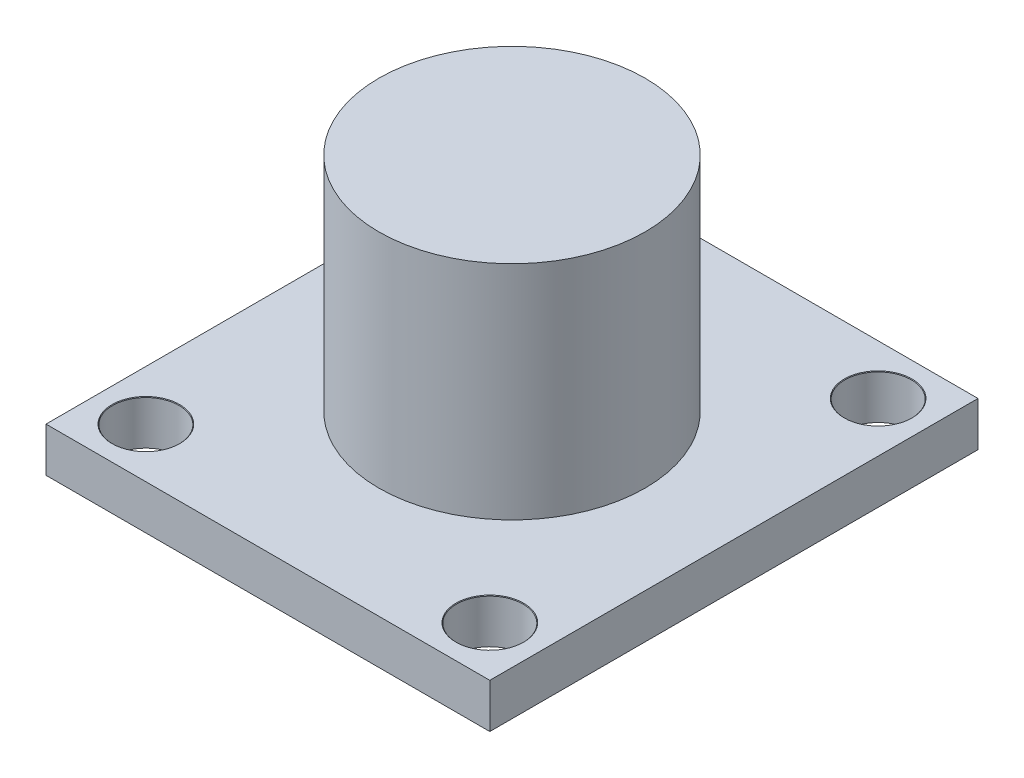
ISO-10303-21;
HEADER;
FILE_DESCRIPTION(('STEP AP214'),'2;1');
FILE_NAME('part.step','',(''),(''),'','','');
FILE_SCHEMA(('AUTOMOTIVE_DESIGN { 1 0 10303 214 1 1 1 1 }'));
ENDSEC;
DATA;
#1=APPLICATION_CONTEXT('core data for automotive mechanical design processes');
#2=APPLICATION_PROTOCOL_DEFINITION('international standard','automotive_design',2000,#1);
#3=PRODUCT_CONTEXT('',#1,'mechanical');
#4=PRODUCT('Part','Part','',(#3));
#5=PRODUCT_RELATED_PRODUCT_CATEGORY('part','',(#4));
#6=PRODUCT_DEFINITION_FORMATION('','',#4);
#7=PRODUCT_DEFINITION_CONTEXT('part definition',#1,'design');
#8=PRODUCT_DEFINITION('design','',#6,#7);
#9=PRODUCT_DEFINITION_SHAPE('','',#8);
#10=(LENGTH_UNIT() NAMED_UNIT(*) SI_UNIT(.MILLI.,.METRE.));
#11=(NAMED_UNIT(*) PLANE_ANGLE_UNIT() SI_UNIT($,.RADIAN.));
#12=(NAMED_UNIT(*) SI_UNIT($,.STERADIAN.) SOLID_ANGLE_UNIT());
#13=UNCERTAINTY_MEASURE_WITH_UNIT(LENGTH_MEASURE(1.E-05),#10,'distance_accuracy_value','');
#14=(GEOMETRIC_REPRESENTATION_CONTEXT(3) GLOBAL_UNCERTAINTY_ASSIGNED_CONTEXT((#13)) GLOBAL_UNIT_ASSIGNED_CONTEXT((#10,
#11,#12)) REPRESENTATION_CONTEXT('',''));
#15=CARTESIAN_POINT('',(0.,0.,0.));
#16=DIRECTION('',(0.,0.,1.));
#17=DIRECTION('',(1.,0.,0.));
#18=AXIS2_PLACEMENT_3D('',#15,#16,#17);
#19=CARTESIAN_POINT('',(10.,2.,-11.));
#20=DIRECTION('',(-1.,0.,0.));
#21=DIRECTION('',(0.,0.,1.));
#22=AXIS2_PLACEMENT_3D('',#19,#20,#21);
#23=PLANE('',#22);
#24=DIRECTION('',(0.,0.,-1.));
#25=VECTOR('',#24,1.);
#26=CARTESIAN_POINT('',(10.,0.,-11.));
#27=LINE('',#26,#25);
#28=CARTESIAN_POINT('',(10.,0.,11.));
#29=VERTEX_POINT('',#28);
#30=CARTESIAN_POINT('',(10.,0.,-11.));
#31=VERTEX_POINT('',#30);
#32=EDGE_CURVE('E109',#29,#31,#27,.T.);
#33=ORIENTED_EDGE('',*,*,#32,.T.);
#34=DIRECTION('',(0.,-1.,0.));
#35=VECTOR('',#34,1.);
#36=CARTESIAN_POINT('',(10.,2.,-11.));
#37=LINE('',#36,#35);
#38=CARTESIAN_POINT('',(10.,2.,-11.));
#39=VERTEX_POINT('',#38);
#40=EDGE_CURVE('E11',#39,#31,#37,.T.);
#41=ORIENTED_EDGE('',*,*,#40,.F.);
#42=DIRECTION('',(0.,0.,-1.));
#43=VECTOR('',#42,1.);
#44=CARTESIAN_POINT('',(10.,2.,-11.));
#45=LINE('',#44,#43);
#46=CARTESIAN_POINT('',(10.,2.,11.));
#47=VERTEX_POINT('',#46);
#48=EDGE_CURVE('E93',#47,#39,#45,.T.);
#49=ORIENTED_EDGE('',*,*,#48,.F.);
#50=DIRECTION('',(0.,-1.,0.));
#51=VECTOR('',#50,1.);
#52=CARTESIAN_POINT('',(10.,2.,11.));
#53=LINE('',#52,#51);
#54=EDGE_CURVE('E105',#47,#29,#53,.T.);
#55=ORIENTED_EDGE('',*,*,#54,.T.);
#56=EDGE_LOOP('',(#33,#41,#49,#55));
#57=FACE_BOUND('',#56,.T.);
#58=ADVANCED_FACE('F41',(#57),#23,.F.);
#59=CARTESIAN_POINT('',(-10.,2.,-11.));
#60=DIRECTION('',(0.,0.,1.));
#61=DIRECTION('',(1.,0.,0.));
#62=AXIS2_PLACEMENT_3D('',#59,#60,#61);
#63=PLANE('',#62);
#64=DIRECTION('',(-1.,0.,0.));
#65=VECTOR('',#64,1.);
#66=CARTESIAN_POINT('',(-10.,0.,-11.));
#67=LINE('',#66,#65);
#68=CARTESIAN_POINT('',(-10.,0.,-11.));
#69=VERTEX_POINT('',#68);
#70=EDGE_CURVE('E98',#31,#69,#67,.T.);
#71=ORIENTED_EDGE('',*,*,#70,.T.);
#72=DIRECTION('',(0.,-1.,0.));
#73=VECTOR('',#72,1.);
#74=CARTESIAN_POINT('',(-10.,2.,-11.));
#75=LINE('',#74,#73);
#76=CARTESIAN_POINT('',(-10.,2.,-11.));
#77=VERTEX_POINT('',#76);
#78=EDGE_CURVE('E50',#77,#69,#75,.T.);
#79=ORIENTED_EDGE('',*,*,#78,.F.);
#80=DIRECTION('',(-1.,0.,0.));
#81=VECTOR('',#80,1.);
#82=CARTESIAN_POINT('',(-10.,2.,-11.));
#83=LINE('',#82,#81);
#84=EDGE_CURVE('E88',#39,#77,#83,.T.);
#85=ORIENTED_EDGE('',*,*,#84,.F.);
#86=ORIENTED_EDGE('',*,*,#40,.T.);
#87=EDGE_LOOP('',(#71,#79,#85,#86));
#88=FACE_BOUND('',#87,.T.);
#89=ADVANCED_FACE('F97',(#88),#63,.F.);
#90=CARTESIAN_POINT('',(-10.,2.,-11.));
#91=DIRECTION('',(1.,0.,0.));
#92=DIRECTION('',(0.,0.,-1.));
#93=AXIS2_PLACEMENT_3D('',#90,#91,#92);
#94=PLANE('',#93);
#95=DIRECTION('',(0.,0.,1.));
#96=VECTOR('',#95,1.);
#97=CARTESIAN_POINT('',(-10.,0.,-11.));
#98=LINE('',#97,#96);
#99=CARTESIAN_POINT('',(-10.,0.,11.));
#100=VERTEX_POINT('',#99);
#101=EDGE_CURVE('E75',#69,#100,#98,.T.);
#102=ORIENTED_EDGE('',*,*,#101,.T.);
#103=DIRECTION('',(0.,-1.,0.));
#104=VECTOR('',#103,1.);
#105=CARTESIAN_POINT('',(-10.,2.,11.));
#106=LINE('',#105,#104);
#107=CARTESIAN_POINT('',(-10.,2.,11.));
#108=VERTEX_POINT('',#107);
#109=EDGE_CURVE('E100',#108,#100,#106,.T.);
#110=ORIENTED_EDGE('',*,*,#109,.F.);
#111=DIRECTION('',(0.,0.,1.));
#112=VECTOR('',#111,1.);
#113=CARTESIAN_POINT('',(-10.,2.,-11.));
#114=LINE('',#113,#112);
#115=EDGE_CURVE('E91',#77,#108,#114,.T.);
#116=ORIENTED_EDGE('',*,*,#115,.F.);
#117=ORIENTED_EDGE('',*,*,#78,.T.);
#118=EDGE_LOOP('',(#102,#110,#116,#117));
#119=FACE_BOUND('',#118,.T.);
#120=ADVANCED_FACE('F101',(#119),#94,.F.);
#121=CARTESIAN_POINT('',(-10.,2.,11.));
#122=DIRECTION('',(0.,0.,-1.));
#123=DIRECTION('',(-1.,0.,0.));
#124=AXIS2_PLACEMENT_3D('',#121,#122,#123);
#125=PLANE('',#124);
#126=DIRECTION('',(1.,0.,0.));
#127=VECTOR('',#126,1.);
#128=CARTESIAN_POINT('',(-10.,0.,11.));
#129=LINE('',#128,#127);
#130=EDGE_CURVE('E81',#100,#29,#129,.T.);
#131=ORIENTED_EDGE('',*,*,#130,.T.);
#132=ORIENTED_EDGE('',*,*,#54,.F.);
#133=DIRECTION('',(1.,0.,0.));
#134=VECTOR('',#133,1.);
#135=CARTESIAN_POINT('',(-10.,2.,11.));
#136=LINE('',#135,#134);
#137=EDGE_CURVE('E58',#108,#47,#136,.T.);
#138=ORIENTED_EDGE('',*,*,#137,.F.);
#139=ORIENTED_EDGE('',*,*,#109,.T.);
#140=EDGE_LOOP('',(#131,#132,#138,#139));
#141=FACE_BOUND('',#140,.T.);
#142=ADVANCED_FACE('F123',(#141),#125,.F.);
#143=CARTESIAN_POINT('',(0.,2.,0.));
#144=DIRECTION('',(0.,1.,0.));
#145=DIRECTION('',(0.,0.,1.));
#146=AXIS2_PLACEMENT_3D('',#143,#144,#145);
#147=PLANE('',#146);
#148=CARTESIAN_POINT('',(0.,2.,0.));
#149=DIRECTION('',(0.,1.,0.));
#150=DIRECTION('',(0.,0.,1.));
#151=AXIS2_PLACEMENT_3D('',#148,#149,#150);
#152=CIRCLE('',#151,6.);
#153=CARTESIAN_POINT('',(0.,2.,6.));
#154=VERTEX_POINT('',#153);
#155=EDGE_CURVE('E178',#154,#154,#152,.T.);
#156=ORIENTED_EDGE('',*,*,#155,.F.);
#157=EDGE_LOOP('',(#156));
#158=FACE_BOUND('',#157,.T.);
#159=CARTESIAN_POINT('',(-7.75,2.,-8.75));
#160=DIRECTION('',(0.,1.,0.));
#161=DIRECTION('',(0.,0.,1.));
#162=AXIS2_PLACEMENT_3D('',#159,#160,#161);
#163=CIRCLE('',#162,1.525);
#164=CARTESIAN_POINT('',(-7.75,2.,-7.225));
#165=VERTEX_POINT('',#164);
#166=EDGE_CURVE('E173',#165,#165,#163,.T.);
#167=ORIENTED_EDGE('',*,*,#166,.F.);
#168=EDGE_LOOP('',(#167));
#169=FACE_BOUND('',#168,.T.);
#170=CARTESIAN_POINT('',(7.75,2.,8.75));
#171=DIRECTION('',(0.,1.,0.));
#172=DIRECTION('',(0.,0.,1.));
#173=AXIS2_PLACEMENT_3D('',#170,#171,#172);
#174=CIRCLE('',#173,1.525);
#175=CARTESIAN_POINT('',(7.75,2.,10.275));
#176=VERTEX_POINT('',#175);
#177=EDGE_CURVE('E161',#176,#176,#174,.T.);
#178=ORIENTED_EDGE('',*,*,#177,.F.);
#179=EDGE_LOOP('',(#178));
#180=FACE_BOUND('',#179,.T.);
#181=CARTESIAN_POINT('',(-7.75,2.,8.75));
#182=DIRECTION('',(0.,1.,0.));
#183=DIRECTION('',(0.,0.,1.));
#184=AXIS2_PLACEMENT_3D('',#181,#182,#183);
#185=CIRCLE('',#184,1.525);
#186=CARTESIAN_POINT('',(-7.75,2.,10.275));
#187=VERTEX_POINT('',#186);
#188=EDGE_CURVE('E149',#187,#187,#185,.T.);
#189=ORIENTED_EDGE('',*,*,#188,.F.);
#190=EDGE_LOOP('',(#189));
#191=FACE_BOUND('',#190,.T.);
#192=CARTESIAN_POINT('',(7.75,2.,-8.75));
#193=DIRECTION('',(0.,1.,0.));
#194=DIRECTION('',(0.,0.,1.));
#195=AXIS2_PLACEMENT_3D('',#192,#193,#194);
#196=CIRCLE('',#195,1.525);
#197=CARTESIAN_POINT('',(7.75,2.,-7.225));
#198=VERTEX_POINT('',#197);
#199=EDGE_CURVE('E137',#198,#198,#196,.T.);
#200=ORIENTED_EDGE('',*,*,#199,.F.);
#201=EDGE_LOOP('',(#200));
#202=FACE_BOUND('',#201,.T.);
#203=ORIENTED_EDGE('',*,*,#48,.T.);
#204=ORIENTED_EDGE('',*,*,#84,.T.);
#205=ORIENTED_EDGE('',*,*,#115,.T.);
#206=ORIENTED_EDGE('',*,*,#137,.T.);
#207=EDGE_LOOP('',(#203,#204,#205,#206));
#208=FACE_BOUND('',#207,.T.);
#209=ADVANCED_FACE('F89',(#158,#169,#180,#191,#202,#208),#147,.T.);
#210=CARTESIAN_POINT('',(0.,0.,0.));
#211=DIRECTION('',(0.,1.,0.));
#212=DIRECTION('',(0.,0.,1.));
#213=AXIS2_PLACEMENT_3D('',#210,#211,#212);
#214=PLANE('',#213);
#215=CARTESIAN_POINT('',(-7.75,0.,-8.75));
#216=DIRECTION('',(0.,1.,0.));
#217=DIRECTION('',(0.,0.,1.));
#218=AXIS2_PLACEMENT_3D('',#215,#216,#217);
#219=CIRCLE('',#218,1.5);
#220=CARTESIAN_POINT('',(-7.75,0.,-7.25));
#221=VERTEX_POINT('',#220);
#222=EDGE_CURVE('E165',#221,#221,#219,.T.);
#223=ORIENTED_EDGE('',*,*,#222,.T.);
#224=EDGE_LOOP('',(#223));
#225=FACE_BOUND('',#224,.T.);
#226=CARTESIAN_POINT('',(7.75,0.,8.75));
#227=DIRECTION('',(0.,1.,0.));
#228=DIRECTION('',(0.,0.,1.));
#229=AXIS2_PLACEMENT_3D('',#226,#227,#228);
#230=CIRCLE('',#229,1.5);
#231=CARTESIAN_POINT('',(7.75,0.,10.25));
#232=VERTEX_POINT('',#231);
#233=EDGE_CURVE('E153',#232,#232,#230,.T.);
#234=ORIENTED_EDGE('',*,*,#233,.T.);
#235=EDGE_LOOP('',(#234));
#236=FACE_BOUND('',#235,.T.);
#237=CARTESIAN_POINT('',(-7.75,0.,8.75));
#238=DIRECTION('',(0.,1.,0.));
#239=DIRECTION('',(0.,0.,1.));
#240=AXIS2_PLACEMENT_3D('',#237,#238,#239);
#241=CIRCLE('',#240,1.5);
#242=CARTESIAN_POINT('',(-7.75,0.,10.25));
#243=VERTEX_POINT('',#242);
#244=EDGE_CURVE('E141',#243,#243,#241,.T.);
#245=ORIENTED_EDGE('',*,*,#244,.T.);
#246=EDGE_LOOP('',(#245));
#247=FACE_BOUND('',#246,.T.);
#248=CARTESIAN_POINT('',(7.75,0.,-8.75));
#249=DIRECTION('',(0.,1.,0.));
#250=DIRECTION('',(0.,0.,1.));
#251=AXIS2_PLACEMENT_3D('',#248,#249,#250);
#252=CIRCLE('',#251,1.5);
#253=CARTESIAN_POINT('',(7.75,0.,-7.25));
#254=VERTEX_POINT('',#253);
#255=EDGE_CURVE('E113',#254,#254,#252,.T.);
#256=ORIENTED_EDGE('',*,*,#255,.T.);
#257=EDGE_LOOP('',(#256));
#258=FACE_BOUND('',#257,.T.);
#259=ORIENTED_EDGE('',*,*,#32,.F.);
#260=ORIENTED_EDGE('',*,*,#130,.F.);
#261=ORIENTED_EDGE('',*,*,#101,.F.);
#262=ORIENTED_EDGE('',*,*,#70,.F.);
#263=EDGE_LOOP('',(#259,#260,#261,#262));
#264=FACE_BOUND('',#263,.T.);
#265=ADVANCED_FACE('F126',(#225,#236,#247,#258,#264),#214,.F.);
#266=CARTESIAN_POINT('',(7.75,2.,-8.75));
#267=DIRECTION('',(0.,1.,0.));
#268=DIRECTION('',(0.,0.,1.));
#269=AXIS2_PLACEMENT_3D('',#266,#267,#268);
#270=CYLINDRICAL_SURFACE('',#269,1.49999999999999);
#271=ORIENTED_EDGE('',*,*,#255,.F.);
#272=EDGE_LOOP('',(#271));
#273=FACE_BOUND('',#272,.T.);
#274=CARTESIAN_POINT('',(7.75,1.975,-8.75));
#275=DIRECTION('',(0.,1.,0.));
#276=DIRECTION('',(0.,0.,1.));
#277=AXIS2_PLACEMENT_3D('',#274,#275,#276);
#278=CIRCLE('',#277,1.49999999999999);
#279=CARTESIAN_POINT('',(7.75,1.975,-7.25000000000001));
#280=VERTEX_POINT('',#279);
#281=EDGE_CURVE('E133',#280,#280,#278,.T.);
#282=ORIENTED_EDGE('',*,*,#281,.T.);
#283=EDGE_LOOP('',(#282));
#284=FACE_BOUND('',#283,.T.);
#285=ADVANCED_FACE('F209',(#273,#284),#270,.F.);
#286=CARTESIAN_POINT('',(7.75,2.,-8.75));
#287=DIRECTION('',(0.,1.,0.));
#288=DIRECTION('',(0.,0.,1.));
#289=AXIS2_PLACEMENT_3D('',#286,#287,#288);
#290=CONICAL_SURFACE('',#289,1.525,0.785398163397726);
#291=ORIENTED_EDGE('',*,*,#281,.F.);
#292=EDGE_LOOP('',(#291));
#293=FACE_BOUND('',#292,.T.);
#294=ORIENTED_EDGE('',*,*,#199,.T.);
#295=EDGE_LOOP('',(#294));
#296=FACE_BOUND('',#295,.T.);
#297=ADVANCED_FACE('F206',(#293,#296),#290,.F.);
#298=CARTESIAN_POINT('',(-7.75,2.,8.75));
#299=DIRECTION('',(0.,1.,0.));
#300=DIRECTION('',(0.,0.,1.));
#301=AXIS2_PLACEMENT_3D('',#298,#299,#300);
#302=CYLINDRICAL_SURFACE('',#301,1.49999999999999);
#303=ORIENTED_EDGE('',*,*,#244,.F.);
#304=EDGE_LOOP('',(#303));
#305=FACE_BOUND('',#304,.T.);
#306=CARTESIAN_POINT('',(-7.75,1.975,8.75));
#307=DIRECTION('',(0.,1.,0.));
#308=DIRECTION('',(0.,0.,1.));
#309=AXIS2_PLACEMENT_3D('',#306,#307,#308);
#310=CIRCLE('',#309,1.49999999999999);
#311=CARTESIAN_POINT('',(-7.75,1.975,10.25));
#312=VERTEX_POINT('',#311);
#313=EDGE_CURVE('E145',#312,#312,#310,.T.);
#314=ORIENTED_EDGE('',*,*,#313,.T.);
#315=EDGE_LOOP('',(#314));
#316=FACE_BOUND('',#315,.T.);
#317=ADVANCED_FACE('F208',(#305,#316),#302,.F.);
#318=CARTESIAN_POINT('',(-7.75,2.,8.75));
#319=DIRECTION('',(0.,1.,0.));
#320=DIRECTION('',(0.,0.,1.));
#321=AXIS2_PLACEMENT_3D('',#318,#319,#320);
#322=CONICAL_SURFACE('',#321,1.525,0.785398163397726);
#323=ORIENTED_EDGE('',*,*,#313,.F.);
#324=EDGE_LOOP('',(#323));
#325=FACE_BOUND('',#324,.T.);
#326=ORIENTED_EDGE('',*,*,#188,.T.);
#327=EDGE_LOOP('',(#326));
#328=FACE_BOUND('',#327,.T.);
#329=ADVANCED_FACE('F216',(#325,#328),#322,.F.);
#330=CARTESIAN_POINT('',(7.75,2.,8.75));
#331=DIRECTION('',(0.,1.,0.));
#332=DIRECTION('',(0.,0.,1.));
#333=AXIS2_PLACEMENT_3D('',#330,#331,#332);
#334=CYLINDRICAL_SURFACE('',#333,1.49999999999999);
#335=ORIENTED_EDGE('',*,*,#233,.F.);
#336=EDGE_LOOP('',(#335));
#337=FACE_BOUND('',#336,.T.);
#338=CARTESIAN_POINT('',(7.75,1.975,8.75));
#339=DIRECTION('',(0.,1.,0.));
#340=DIRECTION('',(0.,0.,1.));
#341=AXIS2_PLACEMENT_3D('',#338,#339,#340);
#342=CIRCLE('',#341,1.49999999999999);
#343=CARTESIAN_POINT('',(7.75,1.975,10.25));
#344=VERTEX_POINT('',#343);
#345=EDGE_CURVE('E157',#344,#344,#342,.T.);
#346=ORIENTED_EDGE('',*,*,#345,.T.);
#347=EDGE_LOOP('',(#346));
#348=FACE_BOUND('',#347,.T.);
#349=ADVANCED_FACE('F250',(#337,#348),#334,.F.);
#350=CARTESIAN_POINT('',(7.75,2.,8.75));
#351=DIRECTION('',(0.,1.,0.));
#352=DIRECTION('',(0.,0.,1.));
#353=AXIS2_PLACEMENT_3D('',#350,#351,#352);
#354=CONICAL_SURFACE('',#353,1.525,0.785398163397726);
#355=ORIENTED_EDGE('',*,*,#345,.F.);
#356=EDGE_LOOP('',(#355));
#357=FACE_BOUND('',#356,.T.);
#358=ORIENTED_EDGE('',*,*,#177,.T.);
#359=EDGE_LOOP('',(#358));
#360=FACE_BOUND('',#359,.T.);
#361=ADVANCED_FACE('F255',(#357,#360),#354,.F.);
#362=CARTESIAN_POINT('',(-7.75,2.,-8.75));
#363=DIRECTION('',(0.,1.,0.));
#364=DIRECTION('',(0.,0.,1.));
#365=AXIS2_PLACEMENT_3D('',#362,#363,#364);
#366=CYLINDRICAL_SURFACE('',#365,1.49999999999999);
#367=ORIENTED_EDGE('',*,*,#222,.F.);
#368=EDGE_LOOP('',(#367));
#369=FACE_BOUND('',#368,.T.);
#370=CARTESIAN_POINT('',(-7.75,1.975,-8.75));
#371=DIRECTION('',(0.,1.,0.));
#372=DIRECTION('',(0.,0.,1.));
#373=AXIS2_PLACEMENT_3D('',#370,#371,#372);
#374=CIRCLE('',#373,1.49999999999999);
#375=CARTESIAN_POINT('',(-7.75,1.975,-7.25000000000001));
#376=VERTEX_POINT('',#375);
#377=EDGE_CURVE('E169',#376,#376,#374,.T.);
#378=ORIENTED_EDGE('',*,*,#377,.T.);
#379=EDGE_LOOP('',(#378));
#380=FACE_BOUND('',#379,.T.);
#381=ADVANCED_FACE('F261',(#369,#380),#366,.F.);
#382=CARTESIAN_POINT('',(-7.75,2.,-8.75));
#383=DIRECTION('',(0.,1.,0.));
#384=DIRECTION('',(0.,0.,1.));
#385=AXIS2_PLACEMENT_3D('',#382,#383,#384);
#386=CONICAL_SURFACE('',#385,1.525,0.785398163397726);
#387=ORIENTED_EDGE('',*,*,#377,.F.);
#388=EDGE_LOOP('',(#387));
#389=FACE_BOUND('',#388,.T.);
#390=ORIENTED_EDGE('',*,*,#166,.T.);
#391=EDGE_LOOP('',(#390));
#392=FACE_BOUND('',#391,.T.);
#393=ADVANCED_FACE('F191',(#389,#392),#386,.F.);
#394=CARTESIAN_POINT('',(0.,12.,0.));
#395=DIRECTION('',(0.,-1.,0.));
#396=DIRECTION('',(0.,0.,-1.));
#397=AXIS2_PLACEMENT_3D('',#394,#395,#396);
#398=CYLINDRICAL_SURFACE('',#397,6.);
#399=CARTESIAN_POINT('',(0.,12.,0.));
#400=DIRECTION('',(0.,1.,0.));
#401=DIRECTION('',(0.,0.,1.));
#402=AXIS2_PLACEMENT_3D('',#399,#400,#401);
#403=CIRCLE('',#402,6.);
#404=CARTESIAN_POINT('',(0.,12.,6.));
#405=VERTEX_POINT('',#404);
#406=EDGE_CURVE('E177',#405,#405,#403,.T.);
#407=ORIENTED_EDGE('',*,*,#406,.F.);
#408=EDGE_LOOP('',(#407));
#409=FACE_BOUND('',#408,.T.);
#410=ORIENTED_EDGE('',*,*,#155,.T.);
#411=EDGE_LOOP('',(#410));
#412=FACE_BOUND('',#411,.T.);
#413=ADVANCED_FACE('F188',(#409,#412),#398,.T.);
#414=CARTESIAN_POINT('',(0.,12.,0.));
#415=DIRECTION('',(0.,1.,0.));
#416=DIRECTION('',(0.,0.,1.));
#417=AXIS2_PLACEMENT_3D('',#414,#415,#416);
#418=PLANE('',#417);
#419=ORIENTED_EDGE('',*,*,#406,.T.);
#420=EDGE_LOOP('',(#419));
#421=FACE_BOUND('',#420,.T.);
#422=ADVANCED_FACE('F186',(#421),#418,.T.);
#423=CLOSED_SHELL('',(#58,#89,#120,#142,#209,#265,#285,#297,#317,#329,#349,#361,#381,#393,#413,#422));
#424=MANIFOLD_SOLID_BREP('B2',#423);
#425=ADVANCED_BREP_SHAPE_REPRESENTATION('',(#18,#424),#14);
#426=SHAPE_DEFINITION_REPRESENTATION(#9,#425);
ENDSEC;
END-ISO-10303-21;
